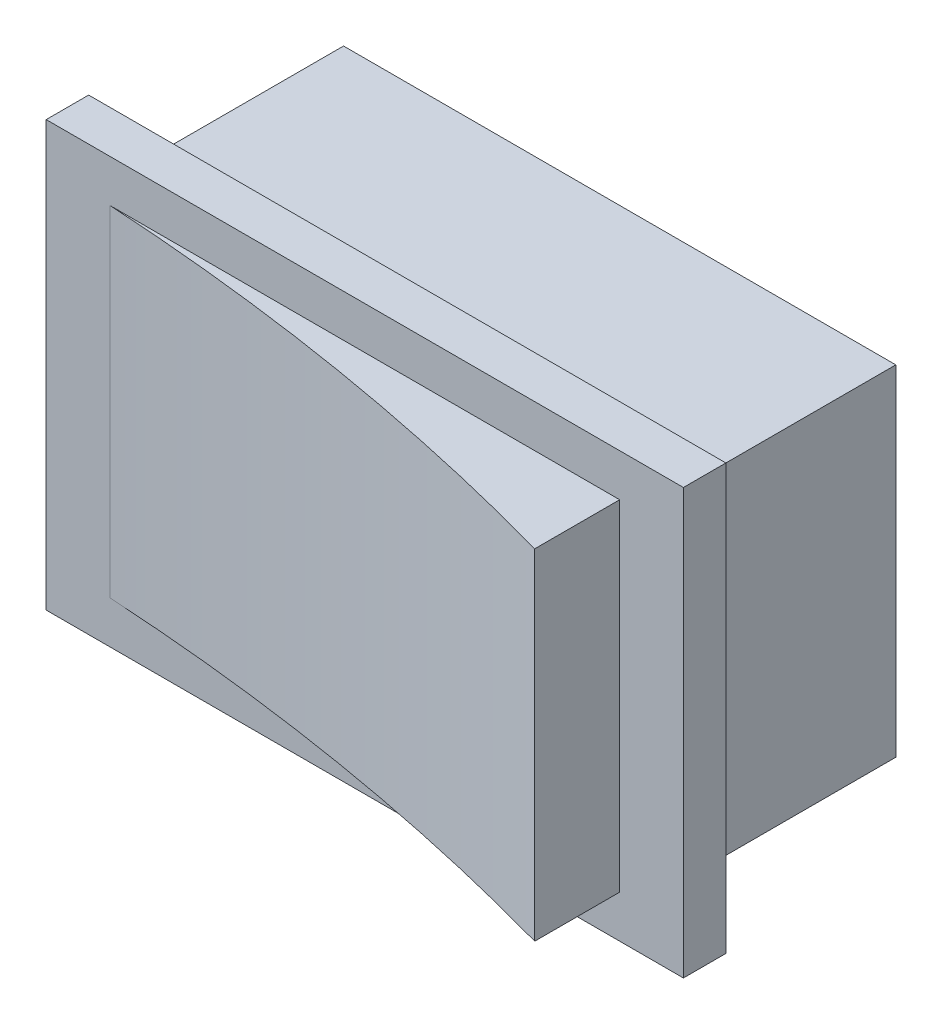
ISO-10303-21;
HEADER;
FILE_DESCRIPTION(('STEP AP214'),'2;1');
FILE_NAME('part.step','',(''),(''),'','','');
FILE_SCHEMA(('AUTOMOTIVE_DESIGN { 1 0 10303 214 1 1 1 1 }'));
ENDSEC;
DATA;
#1=APPLICATION_CONTEXT('core data for automotive mechanical design processes');
#2=APPLICATION_PROTOCOL_DEFINITION('international standard','automotive_design',2000,#1);
#3=PRODUCT_CONTEXT('',#1,'mechanical');
#4=PRODUCT('Part','Part','',(#3));
#5=PRODUCT_RELATED_PRODUCT_CATEGORY('part','',(#4));
#6=PRODUCT_DEFINITION_FORMATION('','',#4);
#7=PRODUCT_DEFINITION_CONTEXT('part definition',#1,'design');
#8=PRODUCT_DEFINITION('design','',#6,#7);
#9=PRODUCT_DEFINITION_SHAPE('','',#8);
#10=(LENGTH_UNIT() NAMED_UNIT(*) SI_UNIT(.MILLI.,.METRE.));
#11=(NAMED_UNIT(*) PLANE_ANGLE_UNIT() SI_UNIT($,.RADIAN.));
#12=(NAMED_UNIT(*) SI_UNIT($,.STERADIAN.) SOLID_ANGLE_UNIT());
#13=UNCERTAINTY_MEASURE_WITH_UNIT(LENGTH_MEASURE(1.E-05),#10,'distance_accuracy_value','');
#14=(GEOMETRIC_REPRESENTATION_CONTEXT(3) GLOBAL_UNCERTAINTY_ASSIGNED_CONTEXT((#13)) GLOBAL_UNIT_ASSIGNED_CONTEXT((#10,
#11,#12)) REPRESENTATION_CONTEXT('',''));
#15=CARTESIAN_POINT('',(0.,0.,0.));
#16=DIRECTION('',(0.,0.,1.));
#17=DIRECTION('',(1.,0.,0.));
#18=AXIS2_PLACEMENT_3D('',#15,#16,#17);
#19=CARTESIAN_POINT('',(0.,0.,6.));
#20=DIRECTION('',(0.,0.,-1.));
#21=DIRECTION('',(-1.,0.,0.));
#22=AXIS2_PLACEMENT_3D('',#19,#20,#21);
#23=PLANE('',#22);
#24=DIRECTION('',(0.,-1.,0.));
#25=VECTOR('',#24,1.);
#26=CARTESIAN_POINT('',(-6.,-4.,6.));
#27=LINE('',#26,#25);
#28=CARTESIAN_POINT('',(-6.,4.,6.));
#29=VERTEX_POINT('',#28);
#30=CARTESIAN_POINT('',(-6.,-4.,6.));
#31=VERTEX_POINT('',#30);
#32=EDGE_CURVE('E54',#29,#31,#27,.T.);
#33=ORIENTED_EDGE('',*,*,#32,.F.);
#34=DIRECTION('',(-1.,0.,0.));
#35=VECTOR('',#34,1.);
#36=CARTESIAN_POINT('',(-6.,4.,6.));
#37=LINE('',#36,#35);
#38=CARTESIAN_POINT('',(6.,4.,6.));
#39=VERTEX_POINT('',#38);
#40=EDGE_CURVE('E49',#39,#29,#37,.T.);
#41=ORIENTED_EDGE('',*,*,#40,.F.);
#42=DIRECTION('',(0.,1.,0.));
#43=VECTOR('',#42,1.);
#44=CARTESIAN_POINT('',(6.,-4.,6.));
#45=LINE('',#44,#43);
#46=CARTESIAN_POINT('',(6.,-4.,6.));
#47=VERTEX_POINT('',#46);
#48=EDGE_CURVE('E123',#47,#39,#45,.T.);
#49=ORIENTED_EDGE('',*,*,#48,.F.);
#50=DIRECTION('',(1.,0.,0.));
#51=VECTOR('',#50,1.);
#52=CARTESIAN_POINT('',(-6.,-4.,6.));
#53=LINE('',#52,#51);
#54=EDGE_CURVE('E135',#31,#47,#53,.T.);
#55=ORIENTED_EDGE('',*,*,#54,.F.);
#56=EDGE_LOOP('',(#33,#41,#49,#55));
#57=FACE_BOUND('',#56,.T.);
#58=DIRECTION('',(-1.,0.,0.));
#59=VECTOR('',#58,1.);
#60=CARTESIAN_POINT('',(-7.5,5.,6.));
#61=LINE('',#60,#59);
#62=CARTESIAN_POINT('',(7.5,5.,6.));
#63=VERTEX_POINT('',#62);
#64=CARTESIAN_POINT('',(-7.5,5.,6.));
#65=VERTEX_POINT('',#64);
#66=EDGE_CURVE('E148',#63,#65,#61,.T.);
#67=ORIENTED_EDGE('',*,*,#66,.T.);
#68=DIRECTION('',(0.,-1.,0.));
#69=VECTOR('',#68,1.);
#70=CARTESIAN_POINT('',(-7.5,-5.,6.));
#71=LINE('',#70,#69);
#72=CARTESIAN_POINT('',(-7.5,-5.,6.));
#73=VERTEX_POINT('',#72);
#74=EDGE_CURVE('E151',#65,#73,#71,.T.);
#75=ORIENTED_EDGE('',*,*,#74,.T.);
#76=DIRECTION('',(1.,0.,0.));
#77=VECTOR('',#76,1.);
#78=CARTESIAN_POINT('',(-7.5,-5.,6.));
#79=LINE('',#78,#77);
#80=CARTESIAN_POINT('',(7.5,-5.,6.));
#81=VERTEX_POINT('',#80);
#82=EDGE_CURVE('E153',#73,#81,#79,.T.);
#83=ORIENTED_EDGE('',*,*,#82,.T.);
#84=DIRECTION('',(0.,1.,0.));
#85=VECTOR('',#84,1.);
#86=CARTESIAN_POINT('',(7.5,-5.,6.));
#87=LINE('',#86,#85);
#88=EDGE_CURVE('E145',#81,#63,#87,.T.);
#89=ORIENTED_EDGE('',*,*,#88,.T.);
#90=EDGE_LOOP('',(#67,#75,#83,#89));
#91=FACE_BOUND('',#90,.T.);
#92=ADVANCED_FACE('F34',(#57,#91),#23,.F.);
#93=CARTESIAN_POINT('',(6.5,-4.,5.));
#94=DIRECTION('',(-1.,0.,0.));
#95=DIRECTION('',(0.,0.,1.));
#96=AXIS2_PLACEMENT_3D('',#93,#94,#95);
#97=PLANE('',#96);
#98=DIRECTION('',(0.,1.,0.));
#99=VECTOR('',#98,1.);
#100=CARTESIAN_POINT('',(6.5,-4.,0.));
#101=LINE('',#100,#99);
#102=CARTESIAN_POINT('',(6.5,-4.,0.));
#103=VERTEX_POINT('',#102);
#104=CARTESIAN_POINT('',(6.5,4.,0.));
#105=VERTEX_POINT('',#104);
#106=EDGE_CURVE('E174',#103,#105,#101,.T.);
#107=ORIENTED_EDGE('',*,*,#106,.T.);
#108=DIRECTION('',(0.,0.,-1.));
#109=VECTOR('',#108,1.);
#110=CARTESIAN_POINT('',(6.5,4.,5.));
#111=LINE('',#110,#109);
#112=CARTESIAN_POINT('',(6.5,4.,5.));
#113=VERTEX_POINT('',#112);
#114=EDGE_CURVE('E11',#113,#105,#111,.T.);
#115=ORIENTED_EDGE('',*,*,#114,.F.);
#116=DIRECTION('',(0.,1.,0.));
#117=VECTOR('',#116,1.);
#118=CARTESIAN_POINT('',(6.5,-4.,5.));
#119=LINE('',#118,#117);
#120=CARTESIAN_POINT('',(6.5,-4.,5.));
#121=VERTEX_POINT('',#120);
#122=EDGE_CURVE('E175',#121,#113,#119,.T.);
#123=ORIENTED_EDGE('',*,*,#122,.F.);
#124=DIRECTION('',(0.,0.,-1.));
#125=VECTOR('',#124,1.);
#126=CARTESIAN_POINT('',(6.5,-4.,5.));
#127=LINE('',#126,#125);
#128=EDGE_CURVE('E188',#121,#103,#127,.T.);
#129=ORIENTED_EDGE('',*,*,#128,.T.);
#130=EDGE_LOOP('',(#107,#115,#123,#129));
#131=FACE_BOUND('',#130,.T.);
#132=ADVANCED_FACE('F36',(#131),#97,.F.);
#133=CARTESIAN_POINT('',(-6.5,4.,5.));
#134=DIRECTION('',(0.,-1.,0.));
#135=DIRECTION('',(0.,0.,-1.));
#136=AXIS2_PLACEMENT_3D('',#133,#134,#135);
#137=PLANE('',#136);
#138=DIRECTION('',(-1.,0.,0.));
#139=VECTOR('',#138,1.);
#140=CARTESIAN_POINT('',(-6.5,4.,0.));
#141=LINE('',#140,#139);
#142=CARTESIAN_POINT('',(-6.5,4.,0.));
#143=VERTEX_POINT('',#142);
#144=EDGE_CURVE('E191',#105,#143,#141,.T.);
#145=ORIENTED_EDGE('',*,*,#144,.T.);
#146=DIRECTION('',(0.,0.,-1.));
#147=VECTOR('',#146,1.);
#148=CARTESIAN_POINT('',(-6.5,4.,5.));
#149=LINE('',#148,#147);
#150=CARTESIAN_POINT('',(-6.5,4.,5.));
#151=VERTEX_POINT('',#150);
#152=EDGE_CURVE('E42',#151,#143,#149,.T.);
#153=ORIENTED_EDGE('',*,*,#152,.F.);
#154=DIRECTION('',(-1.,0.,0.));
#155=VECTOR('',#154,1.);
#156=CARTESIAN_POINT('',(-6.5,4.,5.));
#157=LINE('',#156,#155);
#158=EDGE_CURVE('E178',#113,#151,#157,.T.);
#159=ORIENTED_EDGE('',*,*,#158,.F.);
#160=ORIENTED_EDGE('',*,*,#114,.T.);
#161=EDGE_LOOP('',(#145,#153,#159,#160));
#162=FACE_BOUND('',#161,.T.);
#163=ADVANCED_FACE('F218',(#162),#137,.F.);
#164=CARTESIAN_POINT('',(-6.5,-4.,5.));
#165=DIRECTION('',(1.,0.,0.));
#166=DIRECTION('',(0.,0.,-1.));
#167=AXIS2_PLACEMENT_3D('',#164,#165,#166);
#168=PLANE('',#167);
#169=DIRECTION('',(0.,-1.,0.));
#170=VECTOR('',#169,1.);
#171=CARTESIAN_POINT('',(-6.5,-4.,0.));
#172=LINE('',#171,#170);
#173=CARTESIAN_POINT('',(-6.5,-4.,0.));
#174=VERTEX_POINT('',#173);
#175=EDGE_CURVE('E193',#143,#174,#172,.T.);
#176=ORIENTED_EDGE('',*,*,#175,.T.);
#177=DIRECTION('',(0.,0.,-1.));
#178=VECTOR('',#177,1.);
#179=CARTESIAN_POINT('',(-6.5,-4.,5.));
#180=LINE('',#179,#178);
#181=CARTESIAN_POINT('',(-6.5,-4.,5.));
#182=VERTEX_POINT('',#181);
#183=EDGE_CURVE('E198',#182,#174,#180,.T.);
#184=ORIENTED_EDGE('',*,*,#183,.F.);
#185=DIRECTION('',(0.,-1.,0.));
#186=VECTOR('',#185,1.);
#187=CARTESIAN_POINT('',(-6.5,-4.,5.));
#188=LINE('',#187,#186);
#189=EDGE_CURVE('E182',#151,#182,#188,.T.);
#190=ORIENTED_EDGE('',*,*,#189,.F.);
#191=ORIENTED_EDGE('',*,*,#152,.T.);
#192=EDGE_LOOP('',(#176,#184,#190,#191));
#193=FACE_BOUND('',#192,.T.);
#194=ADVANCED_FACE('F204',(#193),#168,.F.);
#195=CARTESIAN_POINT('',(-6.5,-4.,5.));
#196=DIRECTION('',(0.,1.,0.));
#197=DIRECTION('',(0.,0.,1.));
#198=AXIS2_PLACEMENT_3D('',#195,#196,#197);
#199=PLANE('',#198);
#200=DIRECTION('',(1.,0.,0.));
#201=VECTOR('',#200,1.);
#202=CARTESIAN_POINT('',(-6.5,-4.,0.));
#203=LINE('',#202,#201);
#204=EDGE_CURVE('E179',#174,#103,#203,.T.);
#205=ORIENTED_EDGE('',*,*,#204,.T.);
#206=ORIENTED_EDGE('',*,*,#128,.F.);
#207=DIRECTION('',(1.,0.,0.));
#208=VECTOR('',#207,1.);
#209=CARTESIAN_POINT('',(-6.5,-4.,5.));
#210=LINE('',#209,#208);
#211=EDGE_CURVE('E185',#182,#121,#210,.T.);
#212=ORIENTED_EDGE('',*,*,#211,.F.);
#213=ORIENTED_EDGE('',*,*,#183,.T.);
#214=EDGE_LOOP('',(#205,#206,#212,#213));
#215=FACE_BOUND('',#214,.T.);
#216=ADVANCED_FACE('F212',(#215),#199,.F.);
#217=CARTESIAN_POINT('',(0.,0.,0.));
#218=DIRECTION('',(0.,0.,-1.));
#219=DIRECTION('',(-1.,0.,0.));
#220=AXIS2_PLACEMENT_3D('',#217,#218,#219);
#221=PLANE('',#220);
#222=ORIENTED_EDGE('',*,*,#106,.F.);
#223=ORIENTED_EDGE('',*,*,#204,.F.);
#224=ORIENTED_EDGE('',*,*,#175,.F.);
#225=ORIENTED_EDGE('',*,*,#144,.F.);
#226=EDGE_LOOP('',(#222,#223,#224,#225));
#227=FACE_BOUND('',#226,.T.);
#228=ADVANCED_FACE('F209',(#227),#221,.T.);
#229=CARTESIAN_POINT('',(0.,0.,5.));
#230=DIRECTION('',(0.,0.,-1.));
#231=DIRECTION('',(-1.,0.,0.));
#232=AXIS2_PLACEMENT_3D('',#229,#230,#231);
#233=PLANE('',#232);
#234=DIRECTION('',(0.,1.,0.));
#235=VECTOR('',#234,1.);
#236=CARTESIAN_POINT('',(7.5,-5.,5.));
#237=LINE('',#236,#235);
#238=CARTESIAN_POINT('',(7.5,-5.,5.));
#239=VERTEX_POINT('',#238);
#240=CARTESIAN_POINT('',(7.5,5.,5.));
#241=VERTEX_POINT('',#240);
#242=EDGE_CURVE('E125',#239,#241,#237,.T.);
#243=ORIENTED_EDGE('',*,*,#242,.F.);
#244=DIRECTION('',(1.,0.,0.));
#245=VECTOR('',#244,1.);
#246=CARTESIAN_POINT('',(-7.5,-5.,5.));
#247=LINE('',#246,#245);
#248=CARTESIAN_POINT('',(-7.5,-5.,5.));
#249=VERTEX_POINT('',#248);
#250=EDGE_CURVE('E149',#249,#239,#247,.T.);
#251=ORIENTED_EDGE('',*,*,#250,.F.);
#252=DIRECTION('',(0.,-1.,0.));
#253=VECTOR('',#252,1.);
#254=CARTESIAN_POINT('',(-7.5,-5.,5.));
#255=LINE('',#254,#253);
#256=CARTESIAN_POINT('',(-7.5,5.,5.));
#257=VERTEX_POINT('',#256);
#258=EDGE_CURVE('E160',#257,#249,#255,.T.);
#259=ORIENTED_EDGE('',*,*,#258,.F.);
#260=DIRECTION('',(-1.,0.,0.));
#261=VECTOR('',#260,1.);
#262=CARTESIAN_POINT('',(-7.5,5.,5.));
#263=LINE('',#262,#261);
#264=EDGE_CURVE('E158',#241,#257,#263,.T.);
#265=ORIENTED_EDGE('',*,*,#264,.F.);
#266=EDGE_LOOP('',(#243,#251,#259,#265));
#267=FACE_BOUND('',#266,.T.);
#268=ORIENTED_EDGE('',*,*,#122,.T.);
#269=ORIENTED_EDGE('',*,*,#158,.T.);
#270=ORIENTED_EDGE('',*,*,#189,.T.);
#271=ORIENTED_EDGE('',*,*,#211,.T.);
#272=EDGE_LOOP('',(#268,#269,#270,#271));
#273=FACE_BOUND('',#272,.T.);
#274=ADVANCED_FACE('F217',(#267,#273),#233,.T.);
#275=CARTESIAN_POINT('',(7.5,-5.,6.));
#276=DIRECTION('',(-1.,0.,0.));
#277=DIRECTION('',(0.,0.,1.));
#278=AXIS2_PLACEMENT_3D('',#275,#276,#277);
#279=PLANE('',#278);
#280=ORIENTED_EDGE('',*,*,#242,.T.);
#281=DIRECTION('',(0.,0.,-1.));
#282=VECTOR('',#281,1.);
#283=CARTESIAN_POINT('',(7.5,5.,6.));
#284=LINE('',#283,#282);
#285=EDGE_CURVE('E171',#63,#241,#284,.T.);
#286=ORIENTED_EDGE('',*,*,#285,.F.);
#287=ORIENTED_EDGE('',*,*,#88,.F.);
#288=DIRECTION('',(0.,0.,-1.));
#289=VECTOR('',#288,1.);
#290=CARTESIAN_POINT('',(7.5,-5.,6.));
#291=LINE('',#290,#289);
#292=EDGE_CURVE('E155',#81,#239,#291,.T.);
#293=ORIENTED_EDGE('',*,*,#292,.T.);
#294=EDGE_LOOP('',(#280,#286,#287,#293));
#295=FACE_BOUND('',#294,.T.);
#296=ADVANCED_FACE('F235',(#295),#279,.F.);
#297=CARTESIAN_POINT('',(-7.5,5.,6.));
#298=DIRECTION('',(0.,-1.,0.));
#299=DIRECTION('',(0.,0.,-1.));
#300=AXIS2_PLACEMENT_3D('',#297,#298,#299);
#301=PLANE('',#300);
#302=ORIENTED_EDGE('',*,*,#264,.T.);
#303=DIRECTION('',(0.,0.,-1.));
#304=VECTOR('',#303,1.);
#305=CARTESIAN_POINT('',(-7.5,5.,6.));
#306=LINE('',#305,#304);
#307=EDGE_CURVE('E168',#65,#257,#306,.T.);
#308=ORIENTED_EDGE('',*,*,#307,.F.);
#309=ORIENTED_EDGE('',*,*,#66,.F.);
#310=ORIENTED_EDGE('',*,*,#285,.T.);
#311=EDGE_LOOP('',(#302,#308,#309,#310));
#312=FACE_BOUND('',#311,.T.);
#313=ADVANCED_FACE('F244',(#312),#301,.F.);
#314=CARTESIAN_POINT('',(-7.5,-5.,6.));
#315=DIRECTION('',(1.,0.,0.));
#316=DIRECTION('',(0.,0.,-1.));
#317=AXIS2_PLACEMENT_3D('',#314,#315,#316);
#318=PLANE('',#317);
#319=ORIENTED_EDGE('',*,*,#258,.T.);
#320=DIRECTION('',(0.,0.,-1.));
#321=VECTOR('',#320,1.);
#322=CARTESIAN_POINT('',(-7.5,-5.,6.));
#323=LINE('',#322,#321);
#324=EDGE_CURVE('E165',#73,#249,#323,.T.);
#325=ORIENTED_EDGE('',*,*,#324,.F.);
#326=ORIENTED_EDGE('',*,*,#74,.F.);
#327=ORIENTED_EDGE('',*,*,#307,.T.);
#328=EDGE_LOOP('',(#319,#325,#326,#327));
#329=FACE_BOUND('',#328,.T.);
#330=ADVANCED_FACE('F240',(#329),#318,.F.);
#331=CARTESIAN_POINT('',(-7.5,-5.,6.));
#332=DIRECTION('',(0.,1.,0.));
#333=DIRECTION('',(0.,0.,1.));
#334=AXIS2_PLACEMENT_3D('',#331,#332,#333);
#335=PLANE('',#334);
#336=ORIENTED_EDGE('',*,*,#250,.T.);
#337=ORIENTED_EDGE('',*,*,#292,.F.);
#338=ORIENTED_EDGE('',*,*,#82,.F.);
#339=ORIENTED_EDGE('',*,*,#324,.T.);
#340=EDGE_LOOP('',(#336,#337,#338,#339));
#341=FACE_BOUND('',#340,.T.);
#342=ADVANCED_FACE('F237',(#341),#335,.F.);
#343=CARTESIAN_POINT('',(6.,-4.,8.));
#344=DIRECTION('',(-1.,0.,0.));
#345=DIRECTION('',(0.,0.,1.));
#346=AXIS2_PLACEMENT_3D('',#343,#344,#345);
#347=PLANE('',#346);
#348=ORIENTED_EDGE('',*,*,#48,.T.);
#349=DIRECTION('',(0.,0.,-1.));
#350=VECTOR('',#349,1.);
#351=CARTESIAN_POINT('',(6.,4.,8.));
#352=LINE('',#351,#350);
#353=CARTESIAN_POINT('',(6.00000000000001,4.,8.));
#354=VERTEX_POINT('',#353);
#355=EDGE_CURVE('E116',#354,#39,#352,.T.);
#356=ORIENTED_EDGE('',*,*,#355,.F.);
#357=DIRECTION('',(0.,1.,0.));
#358=VECTOR('',#357,1.);
#359=CARTESIAN_POINT('',(6.,-4.,8.));
#360=LINE('',#359,#358);
#361=CARTESIAN_POINT('',(6.,-4.,8.));
#362=VERTEX_POINT('',#361);
#363=EDGE_CURVE('E121',#362,#354,#360,.T.);
#364=ORIENTED_EDGE('',*,*,#363,.F.);
#365=DIRECTION('',(0.,0.,-1.));
#366=VECTOR('',#365,1.);
#367=CARTESIAN_POINT('',(6.,-4.,8.));
#368=LINE('',#367,#366);
#369=EDGE_CURVE('E126',#362,#47,#368,.T.);
#370=ORIENTED_EDGE('',*,*,#369,.T.);
#371=EDGE_LOOP('',(#348,#356,#364,#370));
#372=FACE_BOUND('',#371,.T.);
#373=ADVANCED_FACE('F118',(#372),#347,.F.);
#374=CARTESIAN_POINT('',(-6.,4.,8.));
#375=DIRECTION('',(0.,-1.,0.));
#376=DIRECTION('',(0.,0.,-1.));
#377=AXIS2_PLACEMENT_3D('',#374,#375,#376);
#378=PLANE('',#377);
#379=ORIENTED_EDGE('',*,*,#40,.T.);
#380=CARTESIAN_POINT('',(-9.34649319963164,4.,63.0789591977899));
#381=DIRECTION('',(0.,-1.,0.));
#382=DIRECTION('',(0.,0.,-1.));
#383=AXIS2_PLACEMENT_3D('',#380,#381,#382);
#384=CIRCLE('',#383,57.1769761340886);
#385=EDGE_CURVE('E129',#29,#354,#384,.T.);
#386=ORIENTED_EDGE('',*,*,#385,.T.);
#387=ORIENTED_EDGE('',*,*,#355,.T.);
#388=EDGE_LOOP('',(#379,#386,#387));
#389=FACE_BOUND('',#388,.T.);
#390=ADVANCED_FACE('F130',(#389),#378,.F.);
#391=CARTESIAN_POINT('',(-6.,-4.,8.));
#392=DIRECTION('',(0.,1.,0.));
#393=DIRECTION('',(0.,0.,1.));
#394=AXIS2_PLACEMENT_3D('',#391,#392,#393);
#395=PLANE('',#394);
#396=ORIENTED_EDGE('',*,*,#369,.F.);
#397=CARTESIAN_POINT('',(-9.34649319963164,-4.,63.0789591977899));
#398=DIRECTION('',(0.,1.,0.));
#399=DIRECTION('',(0.,0.,1.));
#400=AXIS2_PLACEMENT_3D('',#397,#398,#399);
#401=CIRCLE('',#400,57.1769761340886);
#402=EDGE_CURVE('E132',#362,#31,#401,.T.);
#403=ORIENTED_EDGE('',*,*,#402,.T.);
#404=ORIENTED_EDGE('',*,*,#54,.T.);
#405=EDGE_LOOP('',(#396,#403,#404));
#406=FACE_BOUND('',#405,.T.);
#407=ADVANCED_FACE('F296',(#406),#395,.F.);
#408=CARTESIAN_POINT('',(-9.34649319963164,-39.903853654145,63.0789591977899));
#409=DIRECTION('',(0.,1.,0.));
#410=DIRECTION('',(0.,0.,1.));
#411=AXIS2_PLACEMENT_3D('',#408,#409,#410);
#412=CYLINDRICAL_SURFACE('',#411,57.1769761340886);
#413=ORIENTED_EDGE('',*,*,#385,.F.);
#414=ORIENTED_EDGE('',*,*,#32,.T.);
#415=ORIENTED_EDGE('',*,*,#402,.F.);
#416=ORIENTED_EDGE('',*,*,#363,.T.);
#417=EDGE_LOOP('',(#413,#414,#415,#416));
#418=FACE_BOUND('',#417,.T.);
#419=ADVANCED_FACE('F134',(#418),#412,.F.);
#420=CLOSED_SHELL('',(#92,#132,#163,#194,#216,#228,#274,#296,#313,#330,#342,#373,#390,#407,#419));
#421=MANIFOLD_SOLID_BREP('B2',#420);
#422=ADVANCED_BREP_SHAPE_REPRESENTATION('',(#18,#421),#14);
#423=SHAPE_DEFINITION_REPRESENTATION(#9,#422);
ENDSEC;
END-ISO-10303-21;
